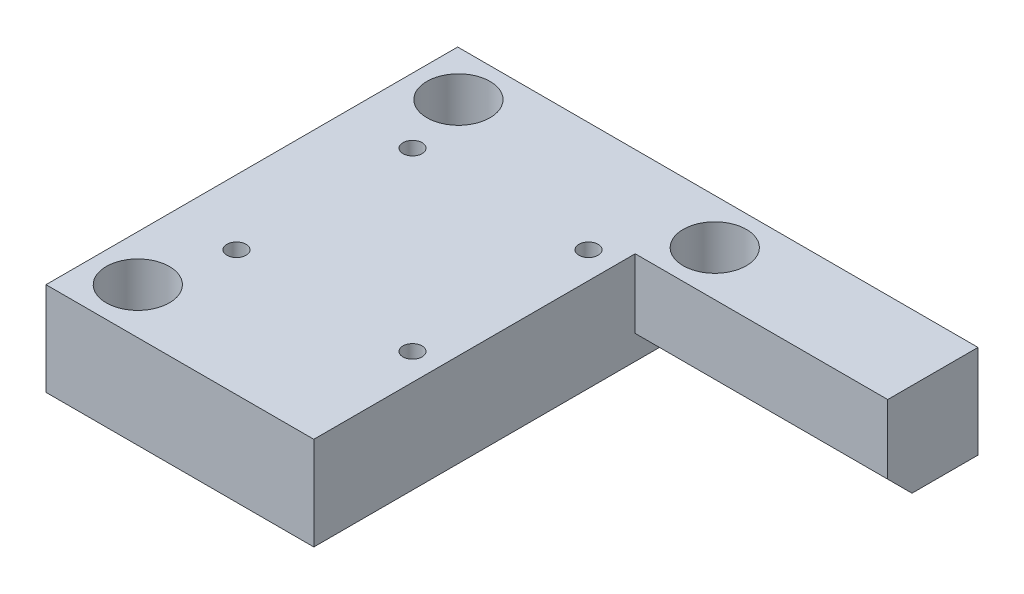
ISO-10303-21;
HEADER;
FILE_DESCRIPTION(('STEP AP214'),'2;1');
FILE_NAME('part.step','',(''),(''),'','','');
FILE_SCHEMA(('AUTOMOTIVE_DESIGN { 1 0 10303 214 1 1 1 1 }'));
ENDSEC;
DATA;
#1=APPLICATION_CONTEXT('core data for automotive mechanical design processes');
#2=APPLICATION_PROTOCOL_DEFINITION('international standard','automotive_design',2000,#1);
#3=PRODUCT_CONTEXT('',#1,'mechanical');
#4=PRODUCT('Part','Part','',(#3));
#5=PRODUCT_RELATED_PRODUCT_CATEGORY('part','',(#4));
#6=PRODUCT_DEFINITION_FORMATION('','',#4);
#7=PRODUCT_DEFINITION_CONTEXT('part definition',#1,'design');
#8=PRODUCT_DEFINITION('design','',#6,#7);
#9=PRODUCT_DEFINITION_SHAPE('','',#8);
#10=(LENGTH_UNIT() NAMED_UNIT(*) SI_UNIT(.MILLI.,.METRE.));
#11=(NAMED_UNIT(*) PLANE_ANGLE_UNIT() SI_UNIT($,.RADIAN.));
#12=(NAMED_UNIT(*) SI_UNIT($,.STERADIAN.) SOLID_ANGLE_UNIT());
#13=UNCERTAINTY_MEASURE_WITH_UNIT(LENGTH_MEASURE(1.E-05),#10,'distance_accuracy_value','');
#14=(GEOMETRIC_REPRESENTATION_CONTEXT(3) GLOBAL_UNCERTAINTY_ASSIGNED_CONTEXT((#13)) GLOBAL_UNIT_ASSIGNED_CONTEXT((#10,
#11,#12)) REPRESENTATION_CONTEXT('',''));
#15=CARTESIAN_POINT('',(0.,0.,0.));
#16=DIRECTION('',(0.,0.,1.));
#17=DIRECTION('',(1.,0.,0.));
#18=AXIS2_PLACEMENT_3D('',#15,#16,#17);
#19=CARTESIAN_POINT('',(6.,-12.19205,47.8));
#20=DIRECTION('',(0.,1.,0.));
#21=DIRECTION('',(0.,0.,1.));
#22=AXIS2_PLACEMENT_3D('',#19,#20,#21);
#23=CYLINDRICAL_SURFACE('',#22,2.25000000000001);
#24=CARTESIAN_POINT('',(6.,-12.192,47.8));
#25=DIRECTION('',(0.,1.,0.));
#26=DIRECTION('',(0.,0.,1.));
#27=AXIS2_PLACEMENT_3D('',#24,#25,#26);
#28=CIRCLE('',#27,2.25000000000001);
#29=CARTESIAN_POINT('',(6.,-12.192,50.05));
#30=VERTEX_POINT('',#29);
#31=EDGE_CURVE('E122',#30,#30,#28,.T.);
#32=CARTESIAN_POINT('',(6.,-7.,47.8));
#33=DIRECTION('',(0.,1.,0.));
#34=DIRECTION('',(0.,0.,1.));
#35=AXIS2_PLACEMENT_3D('',#32,#33,#34);
#36=CIRCLE('',#35,2.25000000000001);
#37=CARTESIAN_POINT('',(6.,-7.,50.05));
#38=VERTEX_POINT('',#37);
#39=EDGE_CURVE('E136',#38,#38,#36,.F.);
#40=CARTESIAN_POINT('',(6.,-12.192,50.05));
#41=CARTESIAN_POINT('',(6.,-12.1379166666667,50.05));
#42=CARTESIAN_POINT('',(6.,-12.0838333333333,50.05));
#43=CARTESIAN_POINT('',(6.,-11.9756666666667,50.05));
#44=CARTESIAN_POINT('',(6.,-11.9215833333333,50.05));
#45=CARTESIAN_POINT('',(6.,-11.8134166666667,50.05));
#46=CARTESIAN_POINT('',(6.,-11.7593333333333,50.05));
#47=CARTESIAN_POINT('',(6.,-11.6511666666667,50.05));
#48=CARTESIAN_POINT('',(6.,-11.5970833333333,50.05));
#49=CARTESIAN_POINT('',(6.,-11.4889166666667,50.05));
#50=CARTESIAN_POINT('',(6.,-11.4348333333333,50.05));
#51=CARTESIAN_POINT('',(6.,-11.3266666666667,50.05));
#52=CARTESIAN_POINT('',(6.,-11.2725833333333,50.05));
#53=CARTESIAN_POINT('',(6.,-11.1644166666667,50.05));
#54=CARTESIAN_POINT('',(6.,-11.1103333333333,50.05));
#55=CARTESIAN_POINT('',(6.,-11.0021666666667,50.05));
#56=CARTESIAN_POINT('',(6.,-10.9480833333333,50.05));
#57=CARTESIAN_POINT('',(6.,-10.8399166666667,50.05));
#58=CARTESIAN_POINT('',(6.,-10.7858333333333,50.05));
#59=CARTESIAN_POINT('',(6.,-10.6776666666667,50.05));
#60=CARTESIAN_POINT('',(6.,-10.6235833333333,50.05));
#61=CARTESIAN_POINT('',(6.,-10.5154166666667,50.05));
#62=CARTESIAN_POINT('',(6.,-10.4613333333333,50.05));
#63=CARTESIAN_POINT('',(6.,-10.3531666666667,50.05));
#64=CARTESIAN_POINT('',(6.,-10.2990833333333,50.05));
#65=CARTESIAN_POINT('',(6.,-10.1909166666667,50.05));
#66=CARTESIAN_POINT('',(6.,-10.1368333333333,50.05));
#67=CARTESIAN_POINT('',(6.,-10.0286666666667,50.05));
#68=CARTESIAN_POINT('',(6.,-9.97458333333333,50.05));
#69=CARTESIAN_POINT('',(6.,-9.86641666666667,50.05));
#70=CARTESIAN_POINT('',(6.,-9.81233333333333,50.05));
#71=CARTESIAN_POINT('',(6.,-9.70416666666667,50.05));
#72=CARTESIAN_POINT('',(6.,-9.65008333333333,50.05));
#73=CARTESIAN_POINT('',(6.,-9.54191666666667,50.05));
#74=CARTESIAN_POINT('',(6.,-9.48783333333333,50.05));
#75=CARTESIAN_POINT('',(6.,-9.37966666666667,50.05));
#76=CARTESIAN_POINT('',(6.,-9.32558333333333,50.05));
#77=CARTESIAN_POINT('',(6.,-9.21741666666667,50.05));
#78=CARTESIAN_POINT('',(6.,-9.16333333333333,50.05));
#79=CARTESIAN_POINT('',(6.,-9.05516666666667,50.05));
#80=CARTESIAN_POINT('',(6.,-9.00108333333333,50.05));
#81=CARTESIAN_POINT('',(6.,-8.89291666666667,50.05));
#82=CARTESIAN_POINT('',(6.,-8.83883333333333,50.05));
#83=CARTESIAN_POINT('',(6.,-8.73066666666667,50.05));
#84=CARTESIAN_POINT('',(6.,-8.67658333333333,50.05));
#85=CARTESIAN_POINT('',(6.,-8.56841666666667,50.05));
#86=CARTESIAN_POINT('',(6.,-8.51433333333333,50.05));
#87=CARTESIAN_POINT('',(6.,-8.40616666666667,50.05));
#88=CARTESIAN_POINT('',(6.,-8.35208333333333,50.05));
#89=CARTESIAN_POINT('',(6.,-8.24391666666667,50.05));
#90=CARTESIAN_POINT('',(6.,-8.18983333333333,50.05));
#91=CARTESIAN_POINT('',(6.,-8.08166666666667,50.05));
#92=CARTESIAN_POINT('',(6.,-8.02758333333333,50.05));
#93=CARTESIAN_POINT('',(6.,-7.91941666666667,50.05));
#94=CARTESIAN_POINT('',(6.,-7.86533333333333,50.05));
#95=CARTESIAN_POINT('',(6.,-7.75716666666667,50.05));
#96=CARTESIAN_POINT('',(6.,-7.70308333333333,50.05));
#97=CARTESIAN_POINT('',(6.,-7.59491666666667,50.05));
#98=CARTESIAN_POINT('',(6.,-7.54083333333333,50.05));
#99=CARTESIAN_POINT('',(6.,-7.43266666666667,50.05));
#100=CARTESIAN_POINT('',(6.,-7.37858333333333,50.05));
#101=CARTESIAN_POINT('',(6.,-7.27041666666667,50.05));
#102=CARTESIAN_POINT('',(6.,-7.21633333333333,50.05));
#103=CARTESIAN_POINT('',(6.,-7.10816666666667,50.05));
#104=CARTESIAN_POINT('',(6.,-7.05408333333333,50.05));
#105=CARTESIAN_POINT('',(6.,-7.,50.05));
#106=B_SPLINE_CURVE_WITH_KNOTS('',3,(#40,#41,#42,#43,#44,#45,#46,#47,#48,#49,#50,#51,#52,#53,
#54,#55,#56,#57,#58,#59,#60,#61,#62,#63,#64,#65,#66,#67,#68,#69,#70,#71,#72,#73,#74,#75,#76,#77,
#78,#79,#80,#81,#82,#83,#84,#85,#86,#87,#88,#89,#90,#91,#92,#93,#94,#95,#96,#97,#98,#99,#100,
#101,#102,#103,#104,#105),.UNSPECIFIED.,.F.,.F.,(4,2,2,2,2,2,2,2,2,2,2,2,2,2,2,2,2,2,2,2,2,2,2,
2,2,2,2,2,2,2,2,2,4),(0.,0.162249999999999,0.324499999999998,0.486749999999999,
0.648999999999999,0.811249999999999,0.973499999999999,1.13575,1.298,1.46025,1.6225,1.78475,
1.947,2.10925,2.2715,2.43375,2.596,2.75825,2.9205,3.08275,3.245,3.40725,3.5695,3.73175,3.894,
4.05625,4.2185,4.38075,4.543,4.70525,4.8675,5.02975,5.192),.UNSPECIFIED.);
#107=EDGE_CURVE('BSEAM38',#30,#38,#106,.T.);
#108=ORIENTED_EDGE('',*,*,#31,.F.);
#109=ORIENTED_EDGE('',*,*,#39,.F.);
#110=ORIENTED_EDGE('',*,*,#107,.T.);
#111=ORIENTED_EDGE('',*,*,#107,.F.);
#112=EDGE_LOOP('',(#108,#110,#109,#111));
#113=FACE_BOUND('',#112,.T.);
#114=ADVANCED_FACE('F38',(#113),#23,.F.);
#115=CARTESIAN_POINT('',(6.,-12.192,5.90000000000001));
#116=DIRECTION('',(0.,1.,0.));
#117=DIRECTION('',(0.,0.,1.));
#118=AXIS2_PLACEMENT_3D('',#115,#116,#117);
#119=CYLINDRICAL_SURFACE('',#118,2.25);
#120=CARTESIAN_POINT('',(6.,-12.192,5.90000000000001));
#121=DIRECTION('',(0.,1.,0.));
#122=DIRECTION('',(0.,0.,1.));
#123=AXIS2_PLACEMENT_3D('',#120,#121,#122);
#124=CIRCLE('',#123,2.25);
#125=CARTESIAN_POINT('',(6.,-12.192,8.15000000000001));
#126=VERTEX_POINT('',#125);
#127=EDGE_CURVE('E187',#126,#126,#124,.T.);
#128=CARTESIAN_POINT('',(6.,-7.,5.90000000000001));
#129=DIRECTION('',(0.,1.,0.));
#130=DIRECTION('',(0.,0.,1.));
#131=AXIS2_PLACEMENT_3D('',#128,#129,#130);
#132=CIRCLE('',#131,2.25);
#133=CARTESIAN_POINT('',(6.,-7.,8.15000000000001));
#134=VERTEX_POINT('',#133);
#135=EDGE_CURVE('E168',#134,#134,#132,.F.);
#136=CARTESIAN_POINT('',(6.,-12.192,8.15000000000001));
#137=CARTESIAN_POINT('',(6.,-12.1379166666667,8.15000000000001));
#138=CARTESIAN_POINT('',(6.,-12.0838333333333,8.15000000000001));
#139=CARTESIAN_POINT('',(6.,-11.9756666666667,8.15000000000001));
#140=CARTESIAN_POINT('',(6.,-11.9215833333333,8.15000000000001));
#141=CARTESIAN_POINT('',(6.,-11.8134166666667,8.15000000000001));
#142=CARTESIAN_POINT('',(6.,-11.7593333333333,8.15000000000001));
#143=CARTESIAN_POINT('',(6.,-11.6511666666667,8.15000000000001));
#144=CARTESIAN_POINT('',(6.,-11.5970833333333,8.15000000000001));
#145=CARTESIAN_POINT('',(6.,-11.4889166666667,8.15000000000001));
#146=CARTESIAN_POINT('',(6.,-11.4348333333333,8.15000000000001));
#147=CARTESIAN_POINT('',(6.,-11.3266666666667,8.15000000000001));
#148=CARTESIAN_POINT('',(6.,-11.2725833333333,8.15000000000001));
#149=CARTESIAN_POINT('',(6.,-11.1644166666667,8.15000000000001));
#150=CARTESIAN_POINT('',(6.,-11.1103333333333,8.15000000000001));
#151=CARTESIAN_POINT('',(6.,-11.0021666666667,8.15000000000001));
#152=CARTESIAN_POINT('',(6.,-10.9480833333333,8.15000000000001));
#153=CARTESIAN_POINT('',(6.,-10.8399166666667,8.15000000000001));
#154=CARTESIAN_POINT('',(6.,-10.7858333333333,8.15000000000001));
#155=CARTESIAN_POINT('',(6.,-10.6776666666667,8.15000000000001));
#156=CARTESIAN_POINT('',(6.,-10.6235833333333,8.15000000000001));
#157=CARTESIAN_POINT('',(6.,-10.5154166666667,8.15000000000001));
#158=CARTESIAN_POINT('',(6.,-10.4613333333333,8.15000000000001));
#159=CARTESIAN_POINT('',(6.,-10.3531666666667,8.15000000000001));
#160=CARTESIAN_POINT('',(6.,-10.2990833333333,8.15000000000001));
#161=CARTESIAN_POINT('',(6.,-10.1909166666667,8.15000000000001));
#162=CARTESIAN_POINT('',(6.,-10.1368333333333,8.15000000000001));
#163=CARTESIAN_POINT('',(6.,-10.0286666666667,8.15000000000001));
#164=CARTESIAN_POINT('',(6.,-9.97458333333333,8.15000000000001));
#165=CARTESIAN_POINT('',(6.,-9.86641666666667,8.15000000000001));
#166=CARTESIAN_POINT('',(6.,-9.81233333333333,8.15000000000001));
#167=CARTESIAN_POINT('',(6.,-9.70416666666667,8.15000000000001));
#168=CARTESIAN_POINT('',(6.,-9.65008333333333,8.15000000000001));
#169=CARTESIAN_POINT('',(6.,-9.54191666666667,8.15000000000001));
#170=CARTESIAN_POINT('',(6.,-9.48783333333333,8.15000000000001));
#171=CARTESIAN_POINT('',(6.,-9.37966666666667,8.15000000000001));
#172=CARTESIAN_POINT('',(6.,-9.32558333333333,8.15000000000001));
#173=CARTESIAN_POINT('',(6.,-9.21741666666667,8.15000000000001));
#174=CARTESIAN_POINT('',(6.,-9.16333333333333,8.15000000000001));
#175=CARTESIAN_POINT('',(6.,-9.05516666666667,8.15000000000001));
#176=CARTESIAN_POINT('',(6.,-9.00108333333333,8.15000000000001));
#177=CARTESIAN_POINT('',(6.,-8.89291666666667,8.15000000000001));
#178=CARTESIAN_POINT('',(6.,-8.83883333333333,8.15000000000001));
#179=CARTESIAN_POINT('',(6.,-8.73066666666667,8.15000000000001));
#180=CARTESIAN_POINT('',(6.,-8.67658333333333,8.15000000000001));
#181=CARTESIAN_POINT('',(6.,-8.56841666666667,8.15000000000001));
#182=CARTESIAN_POINT('',(6.,-8.51433333333333,8.15000000000001));
#183=CARTESIAN_POINT('',(6.,-8.40616666666667,8.15000000000001));
#184=CARTESIAN_POINT('',(6.,-8.35208333333333,8.15000000000001));
#185=CARTESIAN_POINT('',(6.,-8.24391666666667,8.15000000000001));
#186=CARTESIAN_POINT('',(6.,-8.18983333333333,8.15000000000001));
#187=CARTESIAN_POINT('',(6.,-8.08166666666667,8.15000000000001));
#188=CARTESIAN_POINT('',(6.,-8.02758333333333,8.15000000000001));
#189=CARTESIAN_POINT('',(6.,-7.91941666666667,8.15000000000001));
#190=CARTESIAN_POINT('',(6.,-7.86533333333333,8.15000000000001));
#191=CARTESIAN_POINT('',(6.,-7.75716666666667,8.15000000000001));
#192=CARTESIAN_POINT('',(6.,-7.70308333333333,8.15000000000001));
#193=CARTESIAN_POINT('',(6.,-7.59491666666667,8.15000000000001));
#194=CARTESIAN_POINT('',(6.,-7.54083333333333,8.15000000000001));
#195=CARTESIAN_POINT('',(6.,-7.43266666666667,8.15000000000001));
#196=CARTESIAN_POINT('',(6.,-7.37858333333333,8.15000000000001));
#197=CARTESIAN_POINT('',(6.,-7.27041666666667,8.15000000000001));
#198=CARTESIAN_POINT('',(6.,-7.21633333333333,8.15000000000001));
#199=CARTESIAN_POINT('',(6.,-7.10816666666667,8.15000000000001));
#200=CARTESIAN_POINT('',(6.,-7.05408333333333,8.15000000000001));
#201=CARTESIAN_POINT('',(6.,-7.,8.15000000000001));
#202=B_SPLINE_CURVE_WITH_KNOTS('',3,(#136,#137,#138,#139,#140,#141,#142,#143,#144,#145,#146,
#147,#148,#149,#150,#151,#152,#153,#154,#155,#156,#157,#158,#159,#160,#161,#162,#163,#164,#165,
#166,#167,#168,#169,#170,#171,#172,#173,#174,#175,#176,#177,#178,#179,#180,#181,#182,#183,#184,
#185,#186,#187,#188,#189,#190,#191,#192,#193,#194,#195,#196,#197,#198,#199,#200,#201),
.UNSPECIFIED.,.F.,.F.,(4,2,2,2,2,2,2,2,2,2,2,2,2,2,2,2,2,2,2,2,2,2,2,2,2,2,2,2,2,2,2,2,4),(0.,
0.162250000000001,0.3245,0.486750000000001,0.649,0.811250000000001,0.9735,1.13575,1.298,1.46025,
1.6225,1.78475,1.947,2.10925,2.2715,2.43375,2.596,2.75825,2.9205,3.08275,3.245,3.40725,3.5695,
3.73175,3.894,4.05625,4.2185,4.38075,4.543,4.70525,4.8675,5.02975,5.192),.UNSPECIFIED.);
#203=EDGE_CURVE('BSEAM207',#126,#134,#202,.T.);
#204=ORIENTED_EDGE('',*,*,#127,.F.);
#205=ORIENTED_EDGE('',*,*,#135,.F.);
#206=ORIENTED_EDGE('',*,*,#203,.T.);
#207=ORIENTED_EDGE('',*,*,#203,.F.);
#208=EDGE_LOOP('',(#204,#206,#205,#207));
#209=FACE_BOUND('',#208,.T.);
#210=ADVANCED_FACE('F207',(#209),#119,.F.);
#211=CARTESIAN_POINT('',(39.5,-12.192,5.9));
#212=DIRECTION('',(0.,1.,0.));
#213=DIRECTION('',(0.,0.,1.));
#214=AXIS2_PLACEMENT_3D('',#211,#212,#213);
#215=CYLINDRICAL_SURFACE('',#214,2.24999999999999);
#216=CARTESIAN_POINT('',(39.5,-12.192,5.9));
#217=DIRECTION('',(0.,1.,0.));
#218=DIRECTION('',(0.,0.,1.));
#219=AXIS2_PLACEMENT_3D('',#216,#217,#218);
#220=CIRCLE('',#219,2.24999999999999);
#221=CARTESIAN_POINT('',(39.5,-12.192,8.14999999999999));
#222=VERTEX_POINT('',#221);
#223=EDGE_CURVE('E176',#222,#222,#220,.T.);
#224=CARTESIAN_POINT('',(39.5,-7.,5.9));
#225=DIRECTION('',(0.,1.,0.));
#226=DIRECTION('',(0.,0.,1.));
#227=AXIS2_PLACEMENT_3D('',#224,#225,#226);
#228=CIRCLE('',#227,2.24999999999999);
#229=CARTESIAN_POINT('',(39.5,-7.,8.14999999999999));
#230=VERTEX_POINT('',#229);
#231=EDGE_CURVE('E185',#230,#230,#228,.F.);
#232=CARTESIAN_POINT('',(39.5,-12.192,8.14999999999999));
#233=CARTESIAN_POINT('',(39.5,-12.1379166666667,8.14999999999999));
#234=CARTESIAN_POINT('',(39.5,-12.0838333333333,8.14999999999999));
#235=CARTESIAN_POINT('',(39.5,-11.9756666666667,8.14999999999999));
#236=CARTESIAN_POINT('',(39.5,-11.9215833333333,8.14999999999999));
#237=CARTESIAN_POINT('',(39.5,-11.8134166666667,8.14999999999999));
#238=CARTESIAN_POINT('',(39.5,-11.7593333333333,8.14999999999999));
#239=CARTESIAN_POINT('',(39.5,-11.6511666666667,8.14999999999999));
#240=CARTESIAN_POINT('',(39.5,-11.5970833333333,8.14999999999999));
#241=CARTESIAN_POINT('',(39.5,-11.4889166666667,8.14999999999999));
#242=CARTESIAN_POINT('',(39.5,-11.4348333333333,8.14999999999999));
#243=CARTESIAN_POINT('',(39.5,-11.3266666666667,8.14999999999999));
#244=CARTESIAN_POINT('',(39.5,-11.2725833333333,8.14999999999999));
#245=CARTESIAN_POINT('',(39.5,-11.1644166666667,8.14999999999999));
#246=CARTESIAN_POINT('',(39.5,-11.1103333333333,8.14999999999999));
#247=CARTESIAN_POINT('',(39.5,-11.0021666666667,8.14999999999999));
#248=CARTESIAN_POINT('',(39.5,-10.9480833333333,8.14999999999999));
#249=CARTESIAN_POINT('',(39.5,-10.8399166666667,8.14999999999999));
#250=CARTESIAN_POINT('',(39.5,-10.7858333333333,8.14999999999999));
#251=CARTESIAN_POINT('',(39.5,-10.6776666666667,8.14999999999999));
#252=CARTESIAN_POINT('',(39.5,-10.6235833333333,8.14999999999999));
#253=CARTESIAN_POINT('',(39.5,-10.5154166666667,8.14999999999999));
#254=CARTESIAN_POINT('',(39.5,-10.4613333333333,8.14999999999999));
#255=CARTESIAN_POINT('',(39.5,-10.3531666666667,8.14999999999999));
#256=CARTESIAN_POINT('',(39.5,-10.2990833333333,8.14999999999999));
#257=CARTESIAN_POINT('',(39.5,-10.1909166666667,8.14999999999999));
#258=CARTESIAN_POINT('',(39.5,-10.1368333333333,8.14999999999999));
#259=CARTESIAN_POINT('',(39.5,-10.0286666666667,8.14999999999999));
#260=CARTESIAN_POINT('',(39.5,-9.97458333333333,8.14999999999999));
#261=CARTESIAN_POINT('',(39.5,-9.86641666666667,8.14999999999999));
#262=CARTESIAN_POINT('',(39.5,-9.81233333333333,8.14999999999999));
#263=CARTESIAN_POINT('',(39.5,-9.70416666666667,8.14999999999999));
#264=CARTESIAN_POINT('',(39.5,-9.65008333333333,8.14999999999999));
#265=CARTESIAN_POINT('',(39.5,-9.54191666666667,8.14999999999999));
#266=CARTESIAN_POINT('',(39.5,-9.48783333333333,8.14999999999999));
#267=CARTESIAN_POINT('',(39.5,-9.37966666666667,8.14999999999999));
#268=CARTESIAN_POINT('',(39.5,-9.32558333333333,8.14999999999999));
#269=CARTESIAN_POINT('',(39.5,-9.21741666666667,8.14999999999999));
#270=CARTESIAN_POINT('',(39.5,-9.16333333333333,8.14999999999999));
#271=CARTESIAN_POINT('',(39.5,-9.05516666666667,8.14999999999999));
#272=CARTESIAN_POINT('',(39.5,-9.00108333333333,8.14999999999999));
#273=CARTESIAN_POINT('',(39.5,-8.89291666666667,8.14999999999999));
#274=CARTESIAN_POINT('',(39.5,-8.83883333333333,8.14999999999999));
#275=CARTESIAN_POINT('',(39.5,-8.73066666666667,8.14999999999999));
#276=CARTESIAN_POINT('',(39.5,-8.67658333333333,8.14999999999999));
#277=CARTESIAN_POINT('',(39.5,-8.56841666666667,8.14999999999999));
#278=CARTESIAN_POINT('',(39.5,-8.51433333333333,8.14999999999999));
#279=CARTESIAN_POINT('',(39.5,-8.40616666666667,8.14999999999999));
#280=CARTESIAN_POINT('',(39.5,-8.35208333333333,8.14999999999999));
#281=CARTESIAN_POINT('',(39.5,-8.24391666666667,8.14999999999999));
#282=CARTESIAN_POINT('',(39.5,-8.18983333333333,8.14999999999999));
#283=CARTESIAN_POINT('',(39.5,-8.08166666666667,8.14999999999999));
#284=CARTESIAN_POINT('',(39.5,-8.02758333333333,8.14999999999999));
#285=CARTESIAN_POINT('',(39.5,-7.91941666666667,8.14999999999999));
#286=CARTESIAN_POINT('',(39.5,-7.86533333333333,8.14999999999999));
#287=CARTESIAN_POINT('',(39.5,-7.75716666666667,8.14999999999999));
#288=CARTESIAN_POINT('',(39.5,-7.70308333333333,8.14999999999999));
#289=CARTESIAN_POINT('',(39.5,-7.59491666666667,8.14999999999999));
#290=CARTESIAN_POINT('',(39.5,-7.54083333333333,8.14999999999999));
#291=CARTESIAN_POINT('',(39.5,-7.43266666666667,8.14999999999999));
#292=CARTESIAN_POINT('',(39.5,-7.37858333333333,8.14999999999999));
#293=CARTESIAN_POINT('',(39.5,-7.27041666666667,8.14999999999999));
#294=CARTESIAN_POINT('',(39.5,-7.21633333333333,8.14999999999999));
#295=CARTESIAN_POINT('',(39.5,-7.10816666666667,8.14999999999999));
#296=CARTESIAN_POINT('',(39.5,-7.05408333333333,8.14999999999999));
#297=CARTESIAN_POINT('',(39.5,-7.,8.14999999999999));
#298=B_SPLINE_CURVE_WITH_KNOTS('',3,(#232,#233,#234,#235,#236,#237,#238,#239,#240,#241,#242,
#243,#244,#245,#246,#247,#248,#249,#250,#251,#252,#253,#254,#255,#256,#257,#258,#259,#260,#261,
#262,#263,#264,#265,#266,#267,#268,#269,#270,#271,#272,#273,#274,#275,#276,#277,#278,#279,#280,
#281,#282,#283,#284,#285,#286,#287,#288,#289,#290,#291,#292,#293,#294,#295,#296,#297),
.UNSPECIFIED.,.F.,.F.,(4,2,2,2,2,2,2,2,2,2,2,2,2,2,2,2,2,2,2,2,2,2,2,2,2,2,2,2,2,2,2,2,4),(0.,
0.162250000000001,0.3245,0.486750000000001,0.649,0.811250000000001,0.9735,1.13575,1.298,1.46025,
1.6225,1.78475,1.947,2.10925,2.2715,2.43375,2.596,2.75825,2.9205,3.08275,3.245,3.40725,3.5695,
3.73175,3.894,4.05625,4.2185,4.38075,4.543,4.70525,4.8675,5.02975,5.192),.UNSPECIFIED.);
#299=EDGE_CURVE('BSEAM204',#222,#230,#298,.T.);
#300=ORIENTED_EDGE('',*,*,#223,.F.);
#301=ORIENTED_EDGE('',*,*,#231,.F.);
#302=ORIENTED_EDGE('',*,*,#299,.T.);
#303=ORIENTED_EDGE('',*,*,#299,.F.);
#304=EDGE_LOOP('',(#300,#302,#301,#303));
#305=FACE_BOUND('',#304,.T.);
#306=ADVANCED_FACE('F204',(#305),#215,.F.);
#307=CARTESIAN_POINT('',(0.,0.,11.8));
#308=DIRECTION('',(1.,0.,0.));
#309=DIRECTION('',(0.,1.,0.));
#310=AXIS2_PLACEMENT_3D('',#307,#308,#309);
#311=PLANE('',#310);
#312=DIRECTION('',(0.,-1.,0.));
#313=VECTOR('',#312,1.);
#314=CARTESIAN_POINT('',(0.,0.,0.));
#315=LINE('',#314,#313);
#316=CARTESIAN_POINT('',(0.,0.,0.));
#317=VERTEX_POINT('',#316);
#318=CARTESIAN_POINT('',(0.,-12.192,0.));
#319=VERTEX_POINT('',#318);
#320=EDGE_CURVE('E105',#317,#319,#315,.T.);
#321=ORIENTED_EDGE('',*,*,#320,.T.);
#322=DIRECTION('',(0.,0.,-1.));
#323=VECTOR('',#322,1.);
#324=CARTESIAN_POINT('',(0.,-12.192,11.8));
#325=LINE('',#324,#323);
#326=CARTESIAN_POINT('',(0.,-12.192,53.8));
#327=VERTEX_POINT('',#326);
#328=EDGE_CURVE('E98',#327,#319,#325,.T.);
#329=ORIENTED_EDGE('',*,*,#328,.F.);
#330=DIRECTION('',(0.,-1.,0.));
#331=VECTOR('',#330,1.);
#332=CARTESIAN_POINT('',(0.,0.,53.8));
#333=LINE('',#332,#331);
#334=CARTESIAN_POINT('',(0.,0.,53.8));
#335=VERTEX_POINT('',#334);
#336=EDGE_CURVE('E103',#335,#327,#333,.T.);
#337=ORIENTED_EDGE('',*,*,#336,.F.);
#338=DIRECTION('',(0.,0.,-1.));
#339=VECTOR('',#338,1.);
#340=CARTESIAN_POINT('',(0.,0.,11.8));
#341=LINE('',#340,#339);
#342=EDGE_CURVE('E157',#335,#317,#341,.T.);
#343=ORIENTED_EDGE('',*,*,#342,.T.);
#344=EDGE_LOOP('',(#321,#329,#337,#343));
#345=FACE_BOUND('',#344,.T.);
#346=ADVANCED_FACE('F100',(#345),#311,.F.);
#347=CARTESIAN_POINT('',(0.,-12.192,11.8));
#348=DIRECTION('',(0.,1.,0.));
#349=DIRECTION('',(0.,0.,1.));
#350=AXIS2_PLACEMENT_3D('',#347,#348,#349);
#351=PLANE('',#350);
#352=CARTESIAN_POINT('',(31.5021834883644,-12.192,14.402424999977));
#353=DIRECTION('',(0.,1.,0.));
#354=DIRECTION('',(0.,0.,1.));
#355=AXIS2_PLACEMENT_3D('',#352,#353,#354);
#356=CIRCLE('',#355,1.2499999999937);
#357=CARTESIAN_POINT('',(31.5021834883644,-12.192,15.6524249999707));
#358=VERTEX_POINT('',#357);
#359=EDGE_CURVE('E272',#358,#358,#356,.F.);
#360=ORIENTED_EDGE('',*,*,#359,.F.);
#361=EDGE_LOOP('',(#360));
#362=FACE_BOUND('',#361,.T.);
#363=CARTESIAN_POINT('',(31.5000000000003,-12.192,37.4046084883411));
#364=DIRECTION('',(0.,1.,0.));
#365=DIRECTION('',(0.,0.,1.));
#366=AXIS2_PLACEMENT_3D('',#363,#364,#365);
#367=CIRCLE('',#366,1.24999999999371);
#368=CARTESIAN_POINT('',(31.5000000000003,-12.192,38.6546084883348));
#369=VERTEX_POINT('',#368);
#370=EDGE_CURVE('E276',#369,#369,#367,.F.);
#371=ORIENTED_EDGE('',*,*,#370,.F.);
#372=EDGE_LOOP('',(#371));
#373=FACE_BOUND('',#372,.T.);
#374=CARTESIAN_POINT('',(8.497816511636,-12.192,37.4024249999771));
#375=DIRECTION('',(0.,1.,0.));
#376=DIRECTION('',(0.,0.,1.));
#377=AXIS2_PLACEMENT_3D('',#374,#375,#376);
#378=CIRCLE('',#377,1.2499999999937);
#379=CARTESIAN_POINT('',(8.497816511636,-12.192,38.6524249999708));
#380=VERTEX_POINT('',#379);
#381=EDGE_CURVE('E280',#380,#380,#378,.F.);
#382=ORIENTED_EDGE('',*,*,#381,.F.);
#383=EDGE_LOOP('',(#382));
#384=FACE_BOUND('',#383,.T.);
#385=CARTESIAN_POINT('',(8.50000000000008,-12.192,14.4002415116128));
#386=DIRECTION('',(0.,1.,0.));
#387=DIRECTION('',(0.,0.,1.));
#388=AXIS2_PLACEMENT_3D('',#385,#386,#387);
#389=CIRCLE('',#388,1.24999999999369);
#390=CARTESIAN_POINT('',(8.50000000000008,-12.192,15.6502415116065));
#391=VERTEX_POINT('',#390);
#392=EDGE_CURVE('E284',#391,#391,#389,.F.);
#393=ORIENTED_EDGE('',*,*,#392,.F.);
#394=EDGE_LOOP('',(#393));
#395=FACE_BOUND('',#394,.T.);
#396=ORIENTED_EDGE('',*,*,#31,.T.);
#397=EDGE_LOOP('',(#396));
#398=FACE_BOUND('',#397,.T.);
#399=ORIENTED_EDGE('',*,*,#127,.T.);
#400=EDGE_LOOP('',(#399));
#401=FACE_BOUND('',#400,.T.);
#402=ORIENTED_EDGE('',*,*,#223,.T.);
#403=EDGE_LOOP('',(#402));
#404=FACE_BOUND('',#403,.T.);
#405=DIRECTION('',(0.,0.,-1.));
#406=VECTOR('',#405,1.);
#407=CARTESIAN_POINT('',(68.,-12.192,11.8));
#408=LINE('',#407,#406);
#409=CARTESIAN_POINT('',(68.,-12.192,8.62499999999999));
#410=VERTEX_POINT('',#409);
#411=CARTESIAN_POINT('',(68.,-12.192,0.));
#412=VERTEX_POINT('',#411);
#413=EDGE_CURVE('E109',#410,#412,#408,.T.);
#414=ORIENTED_EDGE('',*,*,#413,.F.);
#415=DIRECTION('',(-1.,0.,0.));
#416=VECTOR('',#415,1.);
#417=CARTESIAN_POINT('',(35.,-12.192,8.62499999999999));
#418=LINE('',#417,#416);
#419=CARTESIAN_POINT('',(35.,-12.192,8.62500000000001));
#420=VERTEX_POINT('',#419);
#421=EDGE_CURVE('E46',#410,#420,#418,.T.);
#422=ORIENTED_EDGE('',*,*,#421,.T.);
#423=DIRECTION('',(0.,0.,-1.));
#424=VECTOR('',#423,1.);
#425=CARTESIAN_POINT('',(35.,-12.192,53.8));
#426=LINE('',#425,#424);
#427=CARTESIAN_POINT('',(35.,-12.192,53.8));
#428=VERTEX_POINT('',#427);
#429=EDGE_CURVE('E52',#428,#420,#426,.T.);
#430=ORIENTED_EDGE('',*,*,#429,.F.);
#431=DIRECTION('',(1.,0.,0.));
#432=VECTOR('',#431,1.);
#433=CARTESIAN_POINT('',(0.,-12.192,53.8));
#434=LINE('',#433,#432);
#435=EDGE_CURVE('E111',#327,#428,#434,.T.);
#436=ORIENTED_EDGE('',*,*,#435,.F.);
#437=ORIENTED_EDGE('',*,*,#328,.T.);
#438=DIRECTION('',(1.,0.,0.));
#439=VECTOR('',#438,1.);
#440=CARTESIAN_POINT('',(0.,-12.192,0.));
#441=LINE('',#440,#439);
#442=EDGE_CURVE('E175',#319,#412,#441,.T.);
#443=ORIENTED_EDGE('',*,*,#442,.T.);
#444=EDGE_LOOP('',(#414,#422,#430,#436,#437,#443));
#445=FACE_BOUND('',#444,.T.);
#446=ADVANCED_FACE('F112',(#362,#373,#384,#395,#398,#401,#404,#445),#351,.F.);
#447=CARTESIAN_POINT('',(68.,0.,11.8));
#448=DIRECTION('',(-1.,0.,0.));
#449=DIRECTION('',(0.,0.,1.));
#450=AXIS2_PLACEMENT_3D('',#447,#448,#449);
#451=PLANE('',#450);
#452=DIRECTION('',(0.,1.,0.));
#453=VECTOR('',#452,1.);
#454=CARTESIAN_POINT('',(68.,0.,11.8));
#455=LINE('',#454,#453);
#456=CARTESIAN_POINT('',(68.,-9.017,11.8));
#457=VERTEX_POINT('',#456);
#458=CARTESIAN_POINT('',(68.,0.,11.8));
#459=VERTEX_POINT('',#458);
#460=EDGE_CURVE('E153',#457,#459,#455,.T.);
#461=ORIENTED_EDGE('',*,*,#460,.F.);
#462=DIRECTION('',(0.,-0.707106781186546,-0.707106781186549));
#463=VECTOR('',#462,1.);
#464=CARTESIAN_POINT('',(68.,-9.017,11.8));
#465=LINE('',#464,#463);
#466=EDGE_CURVE('E60',#457,#410,#465,.T.);
#467=ORIENTED_EDGE('',*,*,#466,.T.);
#468=ORIENTED_EDGE('',*,*,#413,.T.);
#469=DIRECTION('',(0.,1.,0.));
#470=VECTOR('',#469,1.);
#471=CARTESIAN_POINT('',(68.,0.,0.));
#472=LINE('',#471,#470);
#473=CARTESIAN_POINT('',(68.,0.,0.));
#474=VERTEX_POINT('',#473);
#475=EDGE_CURVE('E178',#412,#474,#472,.T.);
#476=ORIENTED_EDGE('',*,*,#475,.T.);
#477=DIRECTION('',(0.,0.,-1.));
#478=VECTOR('',#477,1.);
#479=CARTESIAN_POINT('',(68.,0.,11.8));
#480=LINE('',#479,#478);
#481=EDGE_CURVE('E183',#459,#474,#480,.T.);
#482=ORIENTED_EDGE('',*,*,#481,.F.);
#483=EDGE_LOOP('',(#461,#467,#468,#476,#482));
#484=FACE_BOUND('',#483,.T.);
#485=ADVANCED_FACE('F253',(#484),#451,.F.);
#486=CARTESIAN_POINT('',(0.,0.,11.8));
#487=DIRECTION('',(0.,-1.,0.));
#488=DIRECTION('',(0.,0.,-1.));
#489=AXIS2_PLACEMENT_3D('',#486,#487,#488);
#490=PLANE('',#489);
#491=CARTESIAN_POINT('',(31.5021834883644,0.,14.402424999977));
#492=DIRECTION('',(0.,1.,0.));
#493=DIRECTION('',(0.,0.,1.));
#494=AXIS2_PLACEMENT_3D('',#491,#492,#493);
#495=CIRCLE('',#494,1.2499999999937);
#496=CARTESIAN_POINT('',(31.5021834883644,0.,15.6524249999707));
#497=VERTEX_POINT('',#496);
#498=EDGE_CURVE('E322',#497,#497,#495,.T.);
#499=ORIENTED_EDGE('',*,*,#498,.F.);
#500=EDGE_LOOP('',(#499));
#501=FACE_BOUND('',#500,.T.);
#502=CARTESIAN_POINT('',(31.5000000000003,0.,37.4046084883411));
#503=DIRECTION('',(0.,1.,0.));
#504=DIRECTION('',(0.,0.,1.));
#505=AXIS2_PLACEMENT_3D('',#502,#503,#504);
#506=CIRCLE('',#505,1.24999999999371);
#507=CARTESIAN_POINT('',(31.5000000000003,0.,38.6546084883348));
#508=VERTEX_POINT('',#507);
#509=EDGE_CURVE('E318',#508,#508,#506,.T.);
#510=ORIENTED_EDGE('',*,*,#509,.F.);
#511=EDGE_LOOP('',(#510));
#512=FACE_BOUND('',#511,.T.);
#513=CARTESIAN_POINT('',(8.497816511636,0.,37.4024249999771));
#514=DIRECTION('',(0.,1.,0.));
#515=DIRECTION('',(0.,0.,1.));
#516=AXIS2_PLACEMENT_3D('',#513,#514,#515);
#517=CIRCLE('',#516,1.2499999999937);
#518=CARTESIAN_POINT('',(8.497816511636,0.,38.6524249999708));
#519=VERTEX_POINT('',#518);
#520=EDGE_CURVE('E314',#519,#519,#517,.T.);
#521=ORIENTED_EDGE('',*,*,#520,.F.);
#522=EDGE_LOOP('',(#521));
#523=FACE_BOUND('',#522,.T.);
#524=CARTESIAN_POINT('',(8.50000000000008,0.,14.4002415116128));
#525=DIRECTION('',(0.,1.,0.));
#526=DIRECTION('',(0.,0.,1.));
#527=AXIS2_PLACEMENT_3D('',#524,#525,#526);
#528=CIRCLE('',#527,1.24999999999369);
#529=CARTESIAN_POINT('',(8.50000000000008,0.,15.6502415116065));
#530=VERTEX_POINT('',#529);
#531=EDGE_CURVE('E310',#530,#530,#528,.T.);
#532=ORIENTED_EDGE('',*,*,#531,.F.);
#533=EDGE_LOOP('',(#532));
#534=FACE_BOUND('',#533,.T.);
#535=CARTESIAN_POINT('',(6.,0.,47.8));
#536=DIRECTION('',(0.,1.,0.));
#537=DIRECTION('',(0.,0.,1.));
#538=AXIS2_PLACEMENT_3D('',#535,#536,#537);
#539=CIRCLE('',#538,4.125);
#540=CARTESIAN_POINT('',(6.,0.,51.925));
#541=VERTEX_POINT('',#540);
#542=EDGE_CURVE('E303',#541,#541,#539,.T.);
#543=ORIENTED_EDGE('',*,*,#542,.F.);
#544=EDGE_LOOP('',(#543));
#545=FACE_BOUND('',#544,.T.);
#546=CARTESIAN_POINT('',(6.,0.,5.90000000000001));
#547=DIRECTION('',(0.,1.,0.));
#548=DIRECTION('',(0.,0.,1.));
#549=AXIS2_PLACEMENT_3D('',#546,#547,#548);
#550=CIRCLE('',#549,4.125);
#551=CARTESIAN_POINT('',(6.,0.,10.025));
#552=VERTEX_POINT('',#551);
#553=EDGE_CURVE('E161',#552,#552,#550,.T.);
#554=ORIENTED_EDGE('',*,*,#553,.F.);
#555=EDGE_LOOP('',(#554));
#556=FACE_BOUND('',#555,.T.);
#557=CARTESIAN_POINT('',(39.5,0.,5.9));
#558=DIRECTION('',(0.,1.,0.));
#559=DIRECTION('',(0.,0.,1.));
#560=AXIS2_PLACEMENT_3D('',#557,#558,#559);
#561=CIRCLE('',#560,4.125);
#562=CARTESIAN_POINT('',(39.5,0.,10.025));
#563=VERTEX_POINT('',#562);
#564=EDGE_CURVE('E194',#563,#563,#561,.T.);
#565=ORIENTED_EDGE('',*,*,#564,.F.);
#566=EDGE_LOOP('',(#565));
#567=FACE_BOUND('',#566,.T.);
#568=DIRECTION('',(-1.,0.,0.));
#569=VECTOR('',#568,1.);
#570=CARTESIAN_POINT('',(0.,0.,0.));
#571=LINE('',#570,#569);
#572=EDGE_CURVE('E180',#474,#317,#571,.T.);
#573=ORIENTED_EDGE('',*,*,#572,.T.);
#574=ORIENTED_EDGE('',*,*,#342,.F.);
#575=DIRECTION('',(-1.,0.,0.));
#576=VECTOR('',#575,1.);
#577=CARTESIAN_POINT('',(0.,0.,53.8));
#578=LINE('',#577,#576);
#579=CARTESIAN_POINT('',(35.,0.,53.8));
#580=VERTEX_POINT('',#579);
#581=EDGE_CURVE('E119',#580,#335,#578,.T.);
#582=ORIENTED_EDGE('',*,*,#581,.F.);
#583=DIRECTION('',(0.,0.,-1.));
#584=VECTOR('',#583,1.);
#585=CARTESIAN_POINT('',(35.,0.,53.8));
#586=LINE('',#585,#584);
#587=CARTESIAN_POINT('',(35.,0.,11.8));
#588=VERTEX_POINT('',#587);
#589=EDGE_CURVE('E129',#580,#588,#586,.T.);
#590=ORIENTED_EDGE('',*,*,#589,.T.);
#591=DIRECTION('',(-1.,0.,0.));
#592=VECTOR('',#591,1.);
#593=CARTESIAN_POINT('',(0.,0.,11.8));
#594=LINE('',#593,#592);
#595=EDGE_CURVE('E151',#459,#588,#594,.T.);
#596=ORIENTED_EDGE('',*,*,#595,.F.);
#597=ORIENTED_EDGE('',*,*,#481,.T.);
#598=EDGE_LOOP('',(#573,#574,#582,#590,#596,#597));
#599=FACE_BOUND('',#598,.T.);
#600=ADVANCED_FACE('F159',(#501,#512,#523,#534,#545,#556,#567,#599),#490,.F.);
#601=CARTESIAN_POINT('',(0.,0.,11.8));
#602=DIRECTION('',(0.,0.,1.));
#603=DIRECTION('',(1.,0.,0.));
#604=AXIS2_PLACEMENT_3D('',#601,#602,#603);
#605=PLANE('',#604);
#606=DIRECTION('',(0.,1.,0.));
#607=VECTOR('',#606,1.);
#608=CARTESIAN_POINT('',(35.,0.,11.8));
#609=LINE('',#608,#607);
#610=CARTESIAN_POINT('',(35.,-9.017,11.8));
#611=VERTEX_POINT('',#610);
#612=EDGE_CURVE('E120',#611,#588,#609,.T.);
#613=ORIENTED_EDGE('',*,*,#612,.F.);
#614=DIRECTION('',(1.,0.,0.));
#615=VECTOR('',#614,1.);
#616=CARTESIAN_POINT('',(68.,-9.017,11.8));
#617=LINE('',#616,#615);
#618=EDGE_CURVE('E108',#611,#457,#617,.T.);
#619=ORIENTED_EDGE('',*,*,#618,.T.);
#620=ORIENTED_EDGE('',*,*,#460,.T.);
#621=ORIENTED_EDGE('',*,*,#595,.T.);
#622=EDGE_LOOP('',(#613,#619,#620,#621));
#623=FACE_BOUND('',#622,.T.);
#624=ADVANCED_FACE('F149',(#623),#605,.T.);
#625=CARTESIAN_POINT('',(0.,0.,0.));
#626=DIRECTION('',(0.,0.,1.));
#627=DIRECTION('',(1.,0.,0.));
#628=AXIS2_PLACEMENT_3D('',#625,#626,#627);
#629=PLANE('',#628);
#630=ORIENTED_EDGE('',*,*,#320,.F.);
#631=ORIENTED_EDGE('',*,*,#572,.F.);
#632=ORIENTED_EDGE('',*,*,#475,.F.);
#633=ORIENTED_EDGE('',*,*,#442,.F.);
#634=EDGE_LOOP('',(#630,#631,#632,#633));
#635=FACE_BOUND('',#634,.T.);
#636=ADVANCED_FACE('F244',(#635),#629,.F.);
#637=CARTESIAN_POINT('',(39.5,-7.,5.9));
#638=DIRECTION('',(0.,1.,0.));
#639=DIRECTION('',(0.,0.,1.));
#640=AXIS2_PLACEMENT_3D('',#637,#638,#639);
#641=PLANE('',#640);
#642=CARTESIAN_POINT('',(39.5,-7.,5.9));
#643=DIRECTION('',(0.,1.,0.));
#644=DIRECTION('',(0.,0.,1.));
#645=AXIS2_PLACEMENT_3D('',#642,#643,#644);
#646=CIRCLE('',#645,4.125);
#647=CARTESIAN_POINT('',(39.5,-7.,10.025));
#648=VERTEX_POINT('',#647);
#649=EDGE_CURVE('E188',#648,#648,#646,.T.);
#650=ORIENTED_EDGE('',*,*,#649,.T.);
#651=EDGE_LOOP('',(#650));
#652=FACE_BOUND('',#651,.T.);
#653=ORIENTED_EDGE('',*,*,#231,.T.);
#654=EDGE_LOOP('',(#653));
#655=FACE_BOUND('',#654,.T.);
#656=ADVANCED_FACE('F241',(#652,#655),#641,.T.);
#657=CARTESIAN_POINT('',(39.5,-7.,5.9));
#658=DIRECTION('',(0.,1.,0.));
#659=DIRECTION('',(0.,0.,1.));
#660=AXIS2_PLACEMENT_3D('',#657,#658,#659);
#661=CYLINDRICAL_SURFACE('',#660,4.125);
#662=ORIENTED_EDGE('',*,*,#649,.F.);
#663=EDGE_LOOP('',(#662));
#664=FACE_BOUND('',#663,.T.);
#665=ORIENTED_EDGE('',*,*,#564,.T.);
#666=EDGE_LOOP('',(#665));
#667=FACE_BOUND('',#666,.T.);
#668=ADVANCED_FACE('F236',(#664,#667),#661,.F.);
#669=CARTESIAN_POINT('',(6.,-7.,5.90000000000001));
#670=DIRECTION('',(0.,1.,0.));
#671=DIRECTION('',(0.,0.,1.));
#672=AXIS2_PLACEMENT_3D('',#669,#670,#671);
#673=PLANE('',#672);
#674=CARTESIAN_POINT('',(6.,-7.,5.90000000000001));
#675=DIRECTION('',(0.,1.,0.));
#676=DIRECTION('',(0.,0.,1.));
#677=AXIS2_PLACEMENT_3D('',#674,#675,#676);
#678=CIRCLE('',#677,4.125);
#679=CARTESIAN_POINT('',(6.,-7.,10.025));
#680=VERTEX_POINT('',#679);
#681=EDGE_CURVE('E132',#680,#680,#678,.T.);
#682=ORIENTED_EDGE('',*,*,#681,.T.);
#683=EDGE_LOOP('',(#682));
#684=FACE_BOUND('',#683,.T.);
#685=ORIENTED_EDGE('',*,*,#135,.T.);
#686=EDGE_LOOP('',(#685));
#687=FACE_BOUND('',#686,.T.);
#688=ADVANCED_FACE('F233',(#684,#687),#673,.T.);
#689=CARTESIAN_POINT('',(6.,-7.,5.90000000000001));
#690=DIRECTION('',(0.,1.,0.));
#691=DIRECTION('',(0.,0.,1.));
#692=AXIS2_PLACEMENT_3D('',#689,#690,#691);
#693=CYLINDRICAL_SURFACE('',#692,4.125);
#694=ORIENTED_EDGE('',*,*,#681,.F.);
#695=EDGE_LOOP('',(#694));
#696=FACE_BOUND('',#695,.T.);
#697=ORIENTED_EDGE('',*,*,#553,.T.);
#698=EDGE_LOOP('',(#697));
#699=FACE_BOUND('',#698,.T.);
#700=ADVANCED_FACE('F232',(#696,#699),#693,.F.);
#701=CARTESIAN_POINT('',(35.,0.,53.8));
#702=DIRECTION('',(-1.,0.,0.));
#703=DIRECTION('',(0.,0.,1.));
#704=AXIS2_PLACEMENT_3D('',#701,#702,#703);
#705=PLANE('',#704);
#706=ORIENTED_EDGE('',*,*,#429,.T.);
#707=DIRECTION('',(0.,0.707106781186546,0.707106781186549));
#708=VECTOR('',#707,1.);
#709=CARTESIAN_POINT('',(35.,16.4915,37.3085000000001));
#710=LINE('',#709,#708);
#711=EDGE_CURVE('E11',#420,#611,#710,.T.);
#712=ORIENTED_EDGE('',*,*,#711,.T.);
#713=ORIENTED_EDGE('',*,*,#612,.T.);
#714=ORIENTED_EDGE('',*,*,#589,.F.);
#715=DIRECTION('',(0.,1.,0.));
#716=VECTOR('',#715,1.);
#717=CARTESIAN_POINT('',(35.,0.,53.8));
#718=LINE('',#717,#716);
#719=EDGE_CURVE('E114',#428,#580,#718,.T.);
#720=ORIENTED_EDGE('',*,*,#719,.F.);
#721=EDGE_LOOP('',(#706,#712,#713,#714,#720));
#722=FACE_BOUND('',#721,.T.);
#723=ADVANCED_FACE('F145',(#722),#705,.F.);
#724=CARTESIAN_POINT('',(0.,0.,53.8));
#725=DIRECTION('',(0.,0.,1.));
#726=DIRECTION('',(1.,0.,0.));
#727=AXIS2_PLACEMENT_3D('',#724,#725,#726);
#728=PLANE('',#727);
#729=ORIENTED_EDGE('',*,*,#336,.T.);
#730=ORIENTED_EDGE('',*,*,#435,.T.);
#731=ORIENTED_EDGE('',*,*,#719,.T.);
#732=ORIENTED_EDGE('',*,*,#581,.T.);
#733=EDGE_LOOP('',(#729,#730,#731,#732));
#734=FACE_BOUND('',#733,.T.);
#735=ADVANCED_FACE('F117',(#734),#728,.T.);
#736=CARTESIAN_POINT('',(6.,-7.,47.8));
#737=DIRECTION('',(0.,1.,0.));
#738=DIRECTION('',(0.,0.,1.));
#739=AXIS2_PLACEMENT_3D('',#736,#737,#738);
#740=PLANE('',#739);
#741=CARTESIAN_POINT('',(6.,-7.,47.8));
#742=DIRECTION('',(0.,1.,0.));
#743=DIRECTION('',(0.,0.,1.));
#744=AXIS2_PLACEMENT_3D('',#741,#742,#743);
#745=CIRCLE('',#744,4.125);
#746=CARTESIAN_POINT('',(6.,-7.,51.925));
#747=VERTEX_POINT('',#746);
#748=EDGE_CURVE('E299',#747,#747,#745,.T.);
#749=ORIENTED_EDGE('',*,*,#748,.T.);
#750=EDGE_LOOP('',(#749));
#751=FACE_BOUND('',#750,.T.);
#752=ORIENTED_EDGE('',*,*,#39,.T.);
#753=EDGE_LOOP('',(#752));
#754=FACE_BOUND('',#753,.T.);
#755=ADVANCED_FACE('F229',(#751,#754),#740,.T.);
#756=CARTESIAN_POINT('',(6.,-7.,47.8));
#757=DIRECTION('',(0.,1.,0.));
#758=DIRECTION('',(0.,0.,1.));
#759=AXIS2_PLACEMENT_3D('',#756,#757,#758);
#760=CYLINDRICAL_SURFACE('',#759,4.125);
#761=ORIENTED_EDGE('',*,*,#748,.F.);
#762=EDGE_LOOP('',(#761));
#763=FACE_BOUND('',#762,.T.);
#764=ORIENTED_EDGE('',*,*,#542,.T.);
#765=EDGE_LOOP('',(#764));
#766=FACE_BOUND('',#765,.T.);
#767=ADVANCED_FACE('F225',(#763,#766),#760,.F.);
#768=CARTESIAN_POINT('',(8.50000000000008,-12.19305,14.4002415116128));
#769=DIRECTION('',(0.,1.,0.));
#770=DIRECTION('',(0.,0.,1.));
#771=AXIS2_PLACEMENT_3D('',#768,#769,#770);
#772=CYLINDRICAL_SURFACE('',#771,1.24999999999369);
#773=ORIENTED_EDGE('',*,*,#531,.T.);
#774=EDGE_LOOP('',(#773));
#775=FACE_BOUND('',#774,.T.);
#776=ORIENTED_EDGE('',*,*,#392,.T.);
#777=EDGE_LOOP('',(#776));
#778=FACE_BOUND('',#777,.T.);
#779=ADVANCED_FACE('F340',(#775,#778),#772,.F.);
#780=CARTESIAN_POINT('',(8.497816511636,-12.19305,37.4024249999771));
#781=DIRECTION('',(0.,1.,0.));
#782=DIRECTION('',(0.,0.,1.));
#783=AXIS2_PLACEMENT_3D('',#780,#781,#782);
#784=CYLINDRICAL_SURFACE('',#783,1.2499999999937);
#785=ORIENTED_EDGE('',*,*,#520,.T.);
#786=EDGE_LOOP('',(#785));
#787=FACE_BOUND('',#786,.T.);
#788=ORIENTED_EDGE('',*,*,#381,.T.);
#789=EDGE_LOOP('',(#788));
#790=FACE_BOUND('',#789,.T.);
#791=ADVANCED_FACE('F334',(#787,#790),#784,.F.);
#792=CARTESIAN_POINT('',(31.5000000000003,-12.19305,37.4046084883411));
#793=DIRECTION('',(0.,1.,0.));
#794=DIRECTION('',(0.,0.,1.));
#795=AXIS2_PLACEMENT_3D('',#792,#793,#794);
#796=CYLINDRICAL_SURFACE('',#795,1.24999999999371);
#797=ORIENTED_EDGE('',*,*,#509,.T.);
#798=EDGE_LOOP('',(#797));
#799=FACE_BOUND('',#798,.T.);
#800=ORIENTED_EDGE('',*,*,#370,.T.);
#801=EDGE_LOOP('',(#800));
#802=FACE_BOUND('',#801,.T.);
#803=ADVANCED_FACE('F328',(#799,#802),#796,.F.);
#804=CARTESIAN_POINT('',(31.5021834883644,-12.19305,14.402424999977));
#805=DIRECTION('',(0.,1.,0.));
#806=DIRECTION('',(0.,0.,1.));
#807=AXIS2_PLACEMENT_3D('',#804,#805,#806);
#808=CYLINDRICAL_SURFACE('',#807,1.2499999999937);
#809=ORIENTED_EDGE('',*,*,#498,.T.);
#810=EDGE_LOOP('',(#809));
#811=FACE_BOUND('',#810,.T.);
#812=ORIENTED_EDGE('',*,*,#359,.T.);
#813=EDGE_LOOP('',(#812));
#814=FACE_BOUND('',#813,.T.);
#815=ADVANCED_FACE('F325',(#811,#814),#808,.F.);
#816=CARTESIAN_POINT('',(0.,-9.017,11.8));
#817=DIRECTION('',(0.,-0.707106781186549,0.707106781186546));
#818=DIRECTION('',(-1.,0.,0.));
#819=AXIS2_PLACEMENT_3D('',#816,#817,#818);
#820=PLANE('',#819);
#821=ORIENTED_EDGE('',*,*,#711,.F.);
#822=ORIENTED_EDGE('',*,*,#421,.F.);
#823=ORIENTED_EDGE('',*,*,#466,.F.);
#824=ORIENTED_EDGE('',*,*,#618,.F.);
#825=EDGE_LOOP('',(#821,#822,#823,#824));
#826=FACE_BOUND('',#825,.T.);
#827=ADVANCED_FACE('F40',(#826),#820,.T.);
#828=CLOSED_SHELL('',(#114,#210,#306,#346,#446,#485,#600,#624,#636,#656,#668,#688,#700,#723,
#735,#755,#767,#779,#791,#803,#815,#827));
#829=MANIFOLD_SOLID_BREP('B2',#828);
#830=ADVANCED_BREP_SHAPE_REPRESENTATION('',(#18,#829),#14);
#831=SHAPE_DEFINITION_REPRESENTATION(#9,#830);
ENDSEC;
END-ISO-10303-21;
